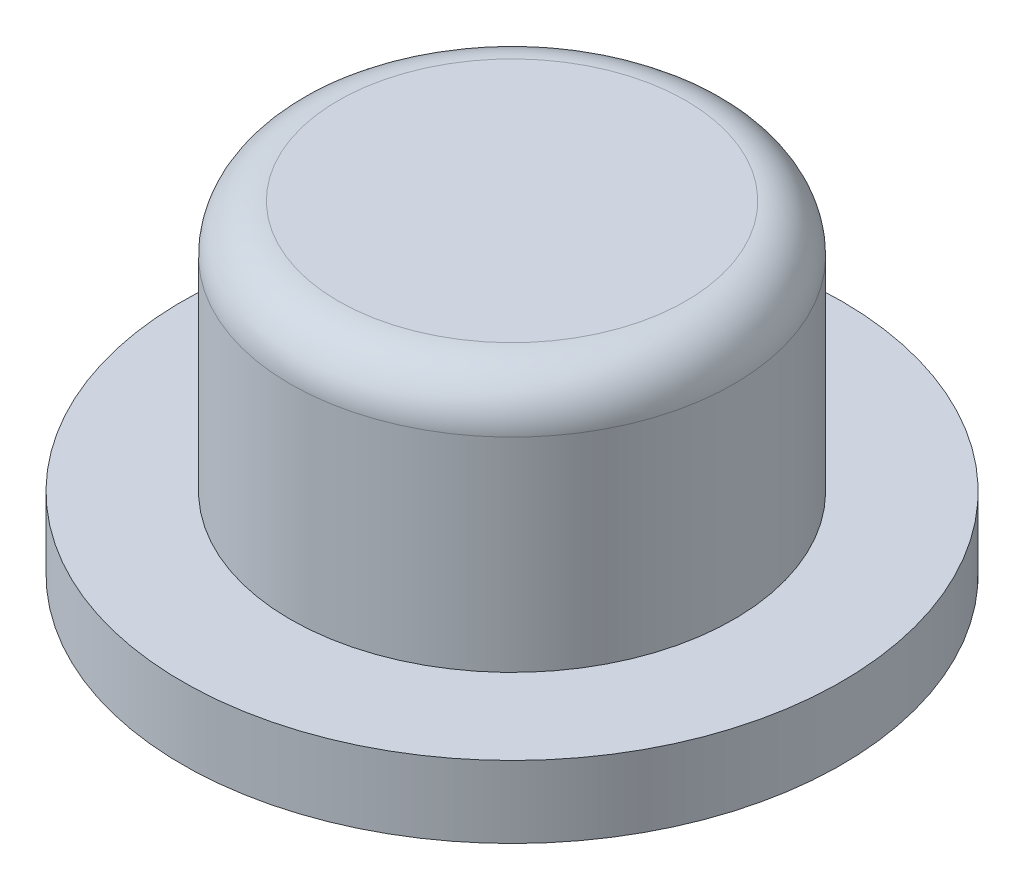
ISO-10303-21;
HEADER;
FILE_DESCRIPTION(('STEP AP214'),'2;1');
FILE_NAME('part.step','',(''),(''),'','','');
FILE_SCHEMA(('AUTOMOTIVE_DESIGN { 1 0 10303 214 1 1 1 1 }'));
ENDSEC;
DATA;
#1=APPLICATION_CONTEXT('core data for automotive mechanical design processes');
#2=APPLICATION_PROTOCOL_DEFINITION('international standard','automotive_design',2000,#1);
#3=PRODUCT_CONTEXT('',#1,'mechanical');
#4=PRODUCT('Part','Part','',(#3));
#5=PRODUCT_RELATED_PRODUCT_CATEGORY('part','',(#4));
#6=PRODUCT_DEFINITION_FORMATION('','',#4);
#7=PRODUCT_DEFINITION_CONTEXT('part definition',#1,'design');
#8=PRODUCT_DEFINITION('design','',#6,#7);
#9=PRODUCT_DEFINITION_SHAPE('','',#8);
#10=(LENGTH_UNIT() NAMED_UNIT(*) SI_UNIT(.MILLI.,.METRE.));
#11=(NAMED_UNIT(*) PLANE_ANGLE_UNIT() SI_UNIT($,.RADIAN.));
#12=(NAMED_UNIT(*) SI_UNIT($,.STERADIAN.) SOLID_ANGLE_UNIT());
#13=UNCERTAINTY_MEASURE_WITH_UNIT(LENGTH_MEASURE(1.E-05),#10,'distance_accuracy_value','');
#14=(GEOMETRIC_REPRESENTATION_CONTEXT(3) GLOBAL_UNCERTAINTY_ASSIGNED_CONTEXT((#13)) GLOBAL_UNIT_ASSIGNED_CONTEXT((#10,
#11,#12)) REPRESENTATION_CONTEXT('',''));
#15=CARTESIAN_POINT('',(0.,0.,0.));
#16=DIRECTION('',(0.,0.,1.));
#17=DIRECTION('',(1.,0.,0.));
#18=AXIS2_PLACEMENT_3D('',#15,#16,#17);
#19=CARTESIAN_POINT('',(0.,0.762,0.));
#20=DIRECTION('',(0.,-1.,0.));
#21=DIRECTION('',(0.,0.,-1.));
#22=AXIS2_PLACEMENT_3D('',#19,#20,#21);
#23=CYLINDRICAL_SURFACE('',#22,3.4925);
#24=CARTESIAN_POINT('',(0.,0.762,0.));
#25=DIRECTION('',(0.,1.,0.));
#26=DIRECTION('',(0.,0.,1.));
#27=AXIS2_PLACEMENT_3D('',#24,#25,#26);
#28=CIRCLE('',#27,3.4925);
#29=CARTESIAN_POINT('',(0.,0.762,-3.4925));
#30=VERTEX_POINT('',#29);
#31=EDGE_CURVE('E48',#30,#30,#28,.T.);
#32=CARTESIAN_POINT('',(0.,0.,0.));
#33=DIRECTION('',(0.,1.,0.));
#34=DIRECTION('',(0.,0.,1.));
#35=AXIS2_PLACEMENT_3D('',#32,#33,#34);
#36=CIRCLE('',#35,3.4925);
#37=CARTESIAN_POINT('',(0.,0.,-3.4925));
#38=VERTEX_POINT('',#37);
#39=EDGE_CURVE('E51',#38,#38,#36,.T.);
#40=CARTESIAN_POINT('',(0.,0.762,-3.4925));
#41=CARTESIAN_POINT('',(0.,0.7540625,-3.4925));
#42=CARTESIAN_POINT('',(0.,0.746125,-3.4925));
#43=CARTESIAN_POINT('',(0.,0.73025,-3.4925));
#44=CARTESIAN_POINT('',(0.,0.7223125,-3.4925));
#45=CARTESIAN_POINT('',(0.,0.7064375,-3.4925));
#46=CARTESIAN_POINT('',(0.,0.6985,-3.4925));
#47=CARTESIAN_POINT('',(0.,0.682625,-3.4925));
#48=CARTESIAN_POINT('',(0.,0.6746875,-3.4925));
#49=CARTESIAN_POINT('',(0.,0.6588125,-3.4925));
#50=CARTESIAN_POINT('',(0.,0.650875,-3.4925));
#51=CARTESIAN_POINT('',(0.,0.635,-3.4925));
#52=CARTESIAN_POINT('',(0.,0.6270625,-3.4925));
#53=CARTESIAN_POINT('',(0.,0.6111875,-3.4925));
#54=CARTESIAN_POINT('',(0.,0.60325,-3.4925));
#55=CARTESIAN_POINT('',(0.,0.587375,-3.4925));
#56=CARTESIAN_POINT('',(0.,0.5794375,-3.4925));
#57=CARTESIAN_POINT('',(0.,0.5635625,-3.4925));
#58=CARTESIAN_POINT('',(0.,0.555625,-3.4925));
#59=CARTESIAN_POINT('',(0.,0.53975,-3.4925));
#60=CARTESIAN_POINT('',(0.,0.5318125,-3.4925));
#61=CARTESIAN_POINT('',(0.,0.5159375,-3.4925));
#62=CARTESIAN_POINT('',(0.,0.508,-3.4925));
#63=CARTESIAN_POINT('',(0.,0.492125,-3.4925));
#64=CARTESIAN_POINT('',(0.,0.4841875,-3.4925));
#65=CARTESIAN_POINT('',(0.,0.4683125,-3.4925));
#66=CARTESIAN_POINT('',(0.,0.460375,-3.4925));
#67=CARTESIAN_POINT('',(0.,0.4445,-3.4925));
#68=CARTESIAN_POINT('',(0.,0.4365625,-3.4925));
#69=CARTESIAN_POINT('',(0.,0.4206875,-3.4925));
#70=CARTESIAN_POINT('',(0.,0.41275,-3.4925));
#71=CARTESIAN_POINT('',(0.,0.396875,-3.4925));
#72=CARTESIAN_POINT('',(0.,0.3889375,-3.4925));
#73=CARTESIAN_POINT('',(0.,0.3730625,-3.4925));
#74=CARTESIAN_POINT('',(0.,0.365125,-3.4925));
#75=CARTESIAN_POINT('',(0.,0.34925,-3.4925));
#76=CARTESIAN_POINT('',(0.,0.3413125,-3.4925));
#77=CARTESIAN_POINT('',(0.,0.3254375,-3.4925));
#78=CARTESIAN_POINT('',(0.,0.3175,-3.4925));
#79=CARTESIAN_POINT('',(0.,0.301625,-3.4925));
#80=CARTESIAN_POINT('',(0.,0.2936875,-3.4925));
#81=CARTESIAN_POINT('',(0.,0.2778125,-3.4925));
#82=CARTESIAN_POINT('',(0.,0.269875,-3.4925));
#83=CARTESIAN_POINT('',(0.,0.254,-3.4925));
#84=CARTESIAN_POINT('',(0.,0.2460625,-3.4925));
#85=CARTESIAN_POINT('',(0.,0.2301875,-3.4925));
#86=CARTESIAN_POINT('',(0.,0.22225,-3.4925));
#87=CARTESIAN_POINT('',(0.,0.206375,-3.4925));
#88=CARTESIAN_POINT('',(0.,0.1984375,-3.4925));
#89=CARTESIAN_POINT('',(0.,0.1825625,-3.4925));
#90=CARTESIAN_POINT('',(0.,0.174625,-3.4925));
#91=CARTESIAN_POINT('',(0.,0.15875,-3.4925));
#92=CARTESIAN_POINT('',(0.,0.1508125,-3.4925));
#93=CARTESIAN_POINT('',(0.,0.1349375,-3.4925));
#94=CARTESIAN_POINT('',(0.,0.127,-3.4925));
#95=CARTESIAN_POINT('',(0.,0.111125,-3.4925));
#96=CARTESIAN_POINT('',(0.,0.1031875,-3.4925));
#97=CARTESIAN_POINT('',(0.,0.0873125,-3.4925));
#98=CARTESIAN_POINT('',(0.,0.079375,-3.4925));
#99=CARTESIAN_POINT('',(0.,0.0635,-3.4925));
#100=CARTESIAN_POINT('',(0.,0.0555625,-3.4925));
#101=CARTESIAN_POINT('',(0.,0.0396875,-3.4925));
#102=CARTESIAN_POINT('',(0.,0.03175,-3.4925));
#103=CARTESIAN_POINT('',(0.,0.015875,-3.4925));
#104=CARTESIAN_POINT('',(0.,0.00793749999999999,-3.4925));
#105=CARTESIAN_POINT('',(0.,0.,-3.4925));
#106=B_SPLINE_CURVE_WITH_KNOTS('',3,(#40,#41,#42,#43,#44,#45,#46,#47,#48,#49,#50,#51,#52,#53,
#54,#55,#56,#57,#58,#59,#60,#61,#62,#63,#64,#65,#66,#67,#68,#69,#70,#71,#72,#73,#74,#75,#76,#77,
#78,#79,#80,#81,#82,#83,#84,#85,#86,#87,#88,#89,#90,#91,#92,#93,#94,#95,#96,#97,#98,#99,#100,
#101,#102,#103,#104,#105),.UNSPECIFIED.,.F.,.F.,(4,2,2,2,2,2,2,2,2,2,2,2,2,2,2,2,2,2,2,2,2,2,2,
2,2,2,2,2,2,2,2,2,4),(0.,0.0238125000000001,0.047625,0.0714375,0.0952500000000001,0.1190625,
0.142875,0.1666875,0.1905,0.2143125,0.238125,0.2619375,0.28575,0.3095625,0.333375,0.3571875,
0.381,0.4048125,0.428625,0.4524375,0.47625,0.5000625,0.523875,0.5476875,0.5715,0.5953125,
0.619125,0.6429375,0.66675,0.6905625,0.714375,0.7381875,0.762),.UNSPECIFIED.);
#107=EDGE_CURVE('BSEAM33',#30,#38,#106,.T.);
#108=ORIENTED_EDGE('',*,*,#31,.F.);
#109=ORIENTED_EDGE('',*,*,#39,.T.);
#110=ORIENTED_EDGE('',*,*,#107,.T.);
#111=ORIENTED_EDGE('',*,*,#107,.F.);
#112=EDGE_LOOP('',(#108,#110,#109,#111));
#113=FACE_BOUND('',#112,.T.);
#114=ADVANCED_FACE('F33',(#113),#23,.T.);
#115=CARTESIAN_POINT('',(0.,0.762,0.));
#116=DIRECTION('',(0.,1.,0.));
#117=DIRECTION('',(0.,0.,1.));
#118=AXIS2_PLACEMENT_3D('',#115,#116,#117);
#119=PLANE('',#118);
#120=CARTESIAN_POINT('',(0.,0.762,0.));
#121=DIRECTION('',(0.,1.,0.));
#122=DIRECTION('',(0.,0.,1.));
#123=AXIS2_PLACEMENT_3D('',#120,#121,#122);
#124=CIRCLE('',#123,2.3495);
#125=CARTESIAN_POINT('',(0.,0.762,2.3495));
#126=VERTEX_POINT('',#125);
#127=EDGE_CURVE('E44',#126,#126,#124,.T.);
#128=ORIENTED_EDGE('',*,*,#127,.F.);
#129=EDGE_LOOP('',(#128));
#130=FACE_BOUND('',#129,.T.);
#131=ORIENTED_EDGE('',*,*,#31,.T.);
#132=EDGE_LOOP('',(#131));
#133=FACE_BOUND('',#132,.T.);
#134=ADVANCED_FACE('F57',(#130,#133),#119,.T.);
#135=CARTESIAN_POINT('',(0.,0.,0.));
#136=DIRECTION('',(0.,1.,0.));
#137=DIRECTION('',(0.,0.,1.));
#138=AXIS2_PLACEMENT_3D('',#135,#136,#137);
#139=PLANE('',#138);
#140=ORIENTED_EDGE('',*,*,#39,.F.);
#141=EDGE_LOOP('',(#140));
#142=FACE_BOUND('',#141,.T.);
#143=ADVANCED_FACE('F63',(#142),#139,.F.);
#144=CARTESIAN_POINT('',(0.,3.429,0.));
#145=DIRECTION('',(0.,-1.,0.));
#146=DIRECTION('',(0.,0.,-1.));
#147=AXIS2_PLACEMENT_3D('',#144,#145,#146);
#148=CYLINDRICAL_SURFACE('',#147,2.3495);
#149=CARTESIAN_POINT('',(0.,2.921,0.));
#150=DIRECTION('',(0.,1.,0.));
#151=DIRECTION('',(0.,0.,1.));
#152=AXIS2_PLACEMENT_3D('',#149,#150,#151);
#153=CIRCLE('',#152,2.3495);
#154=CARTESIAN_POINT('',(0.,2.921,2.3495));
#155=VERTEX_POINT('',#154);
#156=EDGE_CURVE('E10',#155,#155,#153,.F.);
#157=ORIENTED_EDGE('',*,*,#156,.T.);
#158=EDGE_LOOP('',(#157));
#159=FACE_BOUND('',#158,.T.);
#160=ORIENTED_EDGE('',*,*,#127,.T.);
#161=EDGE_LOOP('',(#160));
#162=FACE_BOUND('',#161,.T.);
#163=ADVANCED_FACE('F65',(#159,#162),#148,.T.);
#164=CARTESIAN_POINT('',(0.,3.429,0.));
#165=DIRECTION('',(0.,1.,0.));
#166=DIRECTION('',(0.,0.,1.));
#167=AXIS2_PLACEMENT_3D('',#164,#165,#166);
#168=PLANE('',#167);
#169=CARTESIAN_POINT('',(0.,3.429,0.));
#170=DIRECTION('',(0.,1.,0.));
#171=DIRECTION('',(0.,0.,1.));
#172=AXIS2_PLACEMENT_3D('',#169,#170,#171);
#173=CIRCLE('',#172,1.8415);
#174=CARTESIAN_POINT('',(0.,3.429,1.8415));
#175=VERTEX_POINT('',#174);
#176=EDGE_CURVE('E40',#175,#175,#173,.T.);
#177=ORIENTED_EDGE('',*,*,#176,.T.);
#178=EDGE_LOOP('',(#177));
#179=FACE_BOUND('',#178,.T.);
#180=ADVANCED_FACE('F71',(#179),#168,.T.);
#181=CARTESIAN_POINT('',(0.,2.921,0.));
#182=DIRECTION('',(0.,1.,0.));
#183=DIRECTION('',(0.,0.,1.));
#184=AXIS2_PLACEMENT_3D('',#181,#182,#183);
#185=TOROIDAL_SURFACE('',#184,1.8415,0.508);
#186=ORIENTED_EDGE('',*,*,#156,.F.);
#187=EDGE_LOOP('',(#186));
#188=FACE_BOUND('',#187,.T.);
#189=ORIENTED_EDGE('',*,*,#176,.F.);
#190=EDGE_LOOP('',(#189));
#191=FACE_BOUND('',#190,.T.);
#192=ADVANCED_FACE('F35',(#188,#191),#185,.T.);
#193=CLOSED_SHELL('',(#114,#134,#143,#163,#180,#192));
#194=MANIFOLD_SOLID_BREP('B2',#193);
#195=ADVANCED_BREP_SHAPE_REPRESENTATION('',(#18,#194),#14);
#196=SHAPE_DEFINITION_REPRESENTATION(#9,#195);
ENDSEC;
END-ISO-10303-21;
